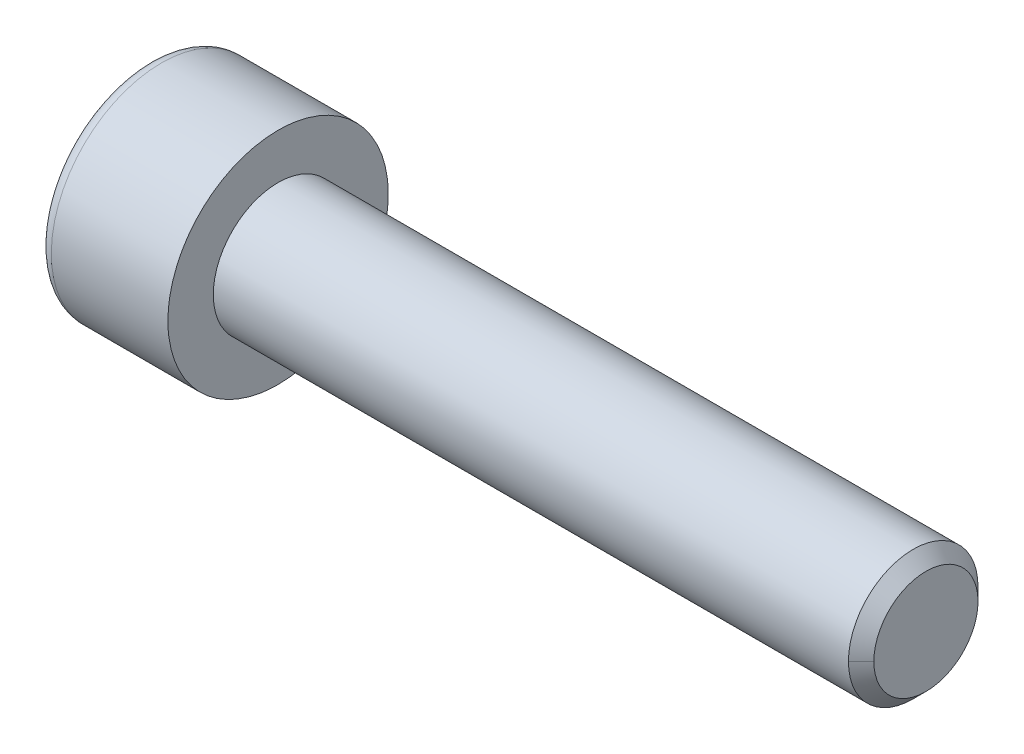
ISO-10303-21;
HEADER;
FILE_DESCRIPTION(('STEP AP214'),'2;1');
FILE_NAME('part.step','',(''),(''),'','','');
FILE_SCHEMA(('AUTOMOTIVE_DESIGN { 1 0 10303 214 1 1 1 1 }'));
ENDSEC;
DATA;
#1=APPLICATION_CONTEXT('core data for automotive mechanical design processes');
#2=APPLICATION_PROTOCOL_DEFINITION('international standard','automotive_design',2000,#1);
#3=PRODUCT_CONTEXT('',#1,'mechanical');
#4=PRODUCT('Part','Part','',(#3));
#5=PRODUCT_RELATED_PRODUCT_CATEGORY('part','',(#4));
#6=PRODUCT_DEFINITION_FORMATION('','',#4);
#7=PRODUCT_DEFINITION_CONTEXT('part definition',#1,'design');
#8=PRODUCT_DEFINITION('design','',#6,#7);
#9=PRODUCT_DEFINITION_SHAPE('','',#8);
#10=(LENGTH_UNIT() NAMED_UNIT(*) SI_UNIT(.MILLI.,.METRE.));
#11=(NAMED_UNIT(*) PLANE_ANGLE_UNIT() SI_UNIT($,.RADIAN.));
#12=(NAMED_UNIT(*) SI_UNIT($,.STERADIAN.) SOLID_ANGLE_UNIT());
#13=UNCERTAINTY_MEASURE_WITH_UNIT(LENGTH_MEASURE(1.E-05),#10,'distance_accuracy_value','');
#14=(GEOMETRIC_REPRESENTATION_CONTEXT(3) GLOBAL_UNCERTAINTY_ASSIGNED_CONTEXT((#13)) GLOBAL_UNIT_ASSIGNED_CONTEXT((#10,
#11,#12)) REPRESENTATION_CONTEXT('',''));
#15=CARTESIAN_POINT('',(0.,0.,0.));
#16=DIRECTION('',(0.,0.,1.));
#17=DIRECTION('',(1.,0.,0.));
#18=AXIS2_PLACEMENT_3D('',#15,#16,#17);
#19=CARTESIAN_POINT('',(25.,-2.03335088,-2.03335088));
#20=DIRECTION('',(1.,0.,0.));
#21=DIRECTION('',(0.,1.,0.));
#22=AXIS2_PLACEMENT_3D('',#19,#20,#21);
#23=PLANE('',#22);
#24=CARTESIAN_POINT('',(25.,0.,0.));
#25=DIRECTION('',(-1.,0.,0.));
#26=DIRECTION('',(0.,0.,1.));
#27=AXIS2_PLACEMENT_3D('',#24,#25,#26);
#28=CIRCLE('',#27,2.00924);
#29=CARTESIAN_POINT('',(25.,-6.86836687895142E-10,-2.00923999999999));
#30=VERTEX_POINT('',#29);
#31=CARTESIAN_POINT('',(25.,-2.40554743613292E-10,2.00923999999999));
#32=VERTEX_POINT('',#31);
#33=EDGE_CURVE('E88',#30,#32,#28,.F.);
#34=ORIENTED_EDGE('',*,*,#33,.T.);
#35=CARTESIAN_POINT('',(25.,0.,0.));
#36=DIRECTION('',(-1.,0.,0.));
#37=DIRECTION('',(0.,0.,1.));
#38=AXIS2_PLACEMENT_3D('',#35,#36,#37);
#39=CIRCLE('',#38,2.00924);
#40=EDGE_CURVE('E21',#32,#30,#39,.F.);
#41=ORIENTED_EDGE('',*,*,#40,.T.);
#42=EDGE_LOOP('',(#34,#41));
#43=FACE_BOUND('',#42,.T.);
#44=ADVANCED_FACE('F17',(#43),#23,.T.);
#45=CARTESIAN_POINT('',(25.,0.,2.00924));
#46=CARTESIAN_POINT('',(24.50924,0.,2.5));
#47=(BOUNDED_CURVE() B_SPLINE_CURVE(1,(#45,#46),.UNSPECIFIED.,.F.,
.F.) B_SPLINE_CURVE_WITH_KNOTS((2,2),(0.,1.00000000000004),
.UNSPECIFIED.) CURVE() GEOMETRIC_REPRESENTATION_ITEM() RATIONAL_B_SPLINE_CURVE((1.,1.)) REPRESENTATION_ITEM(''));
#48=CARTESIAN_POINT('',(1024.50924,0.,0.));
#49=DIRECTION('',(-1.,0.,0.));
#50=AXIS1_PLACEMENT('',#48,#49);
#51=SURFACE_OF_REVOLUTION('',#47,#50);
#52=ORIENTED_EDGE('',*,*,#40,.F.);
#53=DIRECTION('',(-0.707106781186547,-1.26986739101621E-10,0.707106781186548));
#54=VECTOR('',#53,1.);
#55=CARTESIAN_POINT('',(24.75462,-4.04899018551151E-10,2.25462));
#56=LINE('',#55,#54);
#57=CARTESIAN_POINT('',(24.50924,-2.24482960848809E-10,2.50000000000001));
#58=VERTEX_POINT('',#57);
#59=EDGE_CURVE('E91',#32,#58,#56,.T.);
#60=ORIENTED_EDGE('',*,*,#59,.T.);
#61=CARTESIAN_POINT('',(24.50924,0.,0.));
#62=DIRECTION('',(-1.,0.,0.));
#63=DIRECTION('',(0.,0.,1.));
#64=AXIS2_PLACEMENT_3D('',#61,#62,#63);
#65=CIRCLE('',#64,2.5);
#66=CARTESIAN_POINT('',(24.50924,-1.02551714257666E-09,-2.50000000000001));
#67=VERTEX_POINT('',#66);
#68=EDGE_CURVE('E95',#58,#67,#65,.F.);
#69=ORIENTED_EDGE('',*,*,#68,.T.);
#70=DIRECTION('',(0.707106781186547,2.90060050295602E-10,0.707106781186548));
#71=VECTOR('',#70,1.);
#72=CARTESIAN_POINT('',(24.75462,-9.24860583998472E-10,-2.25462));
#73=LINE('',#72,#71);
#74=EDGE_CURVE('E93',#67,#30,#73,.T.);
#75=ORIENTED_EDGE('',*,*,#74,.T.);
#76=EDGE_LOOP('',(#52,#60,#69,#75));
#77=FACE_BOUND('',#76,.T.);
#78=ADVANCED_FACE('F94',(#77),#51,.T.);
#79=CARTESIAN_POINT('',(25.0001414213562,0.,2.00909857864376));
#80=CARTESIAN_POINT('',(25.,0.,2.00924));
#81=CARTESIAN_POINT('',(24.50924,0.,2.5));
#82=(BOUNDED_CURVE() B_SPLINE_CURVE(1,(#79,#80,#81),.UNSPECIFIED.,.F.,
.F.) B_SPLINE_CURVE_WITH_KNOTS((2,1,2),(-0.000288168011927151,4.62494895986565E-11,1.),
.UNSPECIFIED.) CURVE() GEOMETRIC_REPRESENTATION_ITEM() RATIONAL_B_SPLINE_CURVE((1.,1.,1.)) REPRESENTATION_ITEM(''));
#83=CARTESIAN_POINT('',(1024.50924,0.,0.));
#84=DIRECTION('',(-1.,0.,0.));
#85=AXIS1_PLACEMENT('',#83,#84);
#86=SURFACE_OF_REVOLUTION('',#82,#85);
#87=ORIENTED_EDGE('',*,*,#74,.F.);
#88=CARTESIAN_POINT('',(24.50924,0.,0.));
#89=DIRECTION('',(-1.,0.,0.));
#90=DIRECTION('',(0.,0.,1.));
#91=AXIS2_PLACEMENT_3D('',#88,#89,#90);
#92=CIRCLE('',#91,2.5);
#93=EDGE_CURVE('E108',#67,#58,#92,.F.);
#94=ORIENTED_EDGE('',*,*,#93,.T.);
#95=ORIENTED_EDGE('',*,*,#59,.F.);
#96=ORIENTED_EDGE('',*,*,#33,.F.);
#97=EDGE_LOOP('',(#87,#94,#95,#96));
#98=FACE_BOUND('',#97,.T.);
#99=ADVANCED_FACE('F101',(#98),#86,.T.);
#100=CARTESIAN_POINT('',(-1.166666666,0.,0.));
#101=CARTESIAN_POINT('',(-2.508,0.,2.323257483));
#102=(BOUNDED_CURVE() B_SPLINE_CURVE(1,(#100,#101),.UNSPECIFIED.,.F.,
.F.) B_SPLINE_CURVE_WITH_KNOTS((2,2),(0.,1.),
.UNSPECIFIED.) CURVE() GEOMETRIC_REPRESENTATION_ITEM() RATIONAL_B_SPLINE_CURVE((1.,1.)) REPRESENTATION_ITEM(''));
#103=CARTESIAN_POINT('',(997.492,0.,0.));
#104=DIRECTION('',(-1.,0.,0.));
#105=AXIS1_PLACEMENT('',#103,#104);
#106=SURFACE_OF_REVOLUTION('',#102,#105);
#107=CARTESIAN_POINT('',(-1.166666666,0.,0.));
#108=VERTEX_POINT('',#107);
#109=VERTEX_LOOP('',#108);
#110=FACE_BOUND('',#109,.T.);
#111=CARTESIAN_POINT('',(-2.49999999994076,-2.,-1.15470053775231));
#112=CARTESIAN_POINT('',(-2.48567655165512,-2.,-1.10507931773432));
#113=CARTESIAN_POINT('',(-2.47198871078964,-2.,-1.05526823641219));
#114=CARTESIAN_POINT('',(-2.44604690640692,-2.,-0.955218692575869));
#115=CARTESIAN_POINT('',(-2.43379447460794,-2.,-0.904979833791241));
#116=CARTESIAN_POINT('',(-2.41091380130688,-2.,-0.804117092943882));
#117=CARTESIAN_POINT('',(-2.40028604275163,-2.,-0.753493101073635));
#118=CARTESIAN_POINT('',(-2.37601016772818,-2.,-0.626639542162072));
#119=CARTESIAN_POINT('',(-2.36348630626666,-2.,-0.550189309523977));
#120=CARTESIAN_POINT('',(-2.34306885503139,-2.,-0.396671574205417));
#121=CARTESIAN_POINT('',(-2.33517516655927,-2.,-0.319604084718113));
#122=CARTESIAN_POINT('',(-2.32268432555711,-2.,-0.139619688842338));
#123=CARTESIAN_POINT('',(-2.32003239400898,-2.,-0.0365584864338747));
#124=CARTESIAN_POINT('',(-2.32397535370215,-2.,0.169407104774963));
#125=CARTESIAN_POINT('',(-2.33057305877728,-2.,0.272311436318865));
#126=CARTESIAN_POINT('',(-2.35234479113069,-2.,0.477116467372633));
#127=CARTESIAN_POINT('',(-2.36751355138492,-2.,0.579017744182629));
#128=CARTESIAN_POINT('',(-2.40514304704038,-2.,0.781457900875611));
#129=CARTESIAN_POINT('',(-2.42760505461591,-2.,0.881996539881626));
#130=CARTESIAN_POINT('',(-2.46035679018023,-2.,1.01073167838896));
#131=CARTESIAN_POINT('',(-2.46797293838578,-2.,1.03963527257175));
#132=CARTESIAN_POINT('',(-2.48365524704736,-2.,1.09727927796046));
#133=CARTESIAN_POINT('',(-2.49172080087081,-2.,1.12601985408537));
#134=CARTESIAN_POINT('',(-2.49999999998173,-2.,1.15470053789423));
#135=B_SPLINE_CURVE_WITH_KNOTS('',3,(#111,#112,#113,#114,#115,#116,#117,#118,#119,#120,#121,
#122,#123,#124,#125,#126,#127,#128,#129,#130,#131,#132,#133,#134),.UNSPECIFIED.,.F.,.F.,(4,2,2,
2,2,2,2,2,2,2,2,4),(0.,0.154946742163082,0.310057349590026,0.465213975574503,0.697487987448034,
0.929757047907446,1.23861321261436,1.54756335490868,1.85632384950566,2.16513823071313,
2.25480717406297,2.34435787914655),.UNSPECIFIED.);
#136=CARTESIAN_POINT('',(-2.4999999998186,-1.99999999993079,-1.15470053803996));
#137=VERTEX_POINT('',#136);
#138=CARTESIAN_POINT('',(-2.49999999995344,-1.99999999986934,1.15470053802255));
#139=VERTEX_POINT('',#138);
#140=EDGE_CURVE('E400',#137,#139,#135,.T.);
#141=ORIENTED_EDGE('',*,*,#140,.T.);
#142=CARTESIAN_POINT('',(-2.49999999992515,-1.99999999973868,1.15470053815087));
#143=CARTESIAN_POINT('',(-2.48567655163891,-1.95702676264271,1.17951114816952));
#144=CARTESIAN_POINT('',(-2.47198871077284,-1.91388910083416,1.20441668884029));
#145=CARTESIAN_POINT('',(-2.44604690638884,-1.82724365424769,1.25444146077793));
#146=CARTESIAN_POINT('',(-2.43379447458918,-1.78373552628951,1.27956089018003));
#147=CARTESIAN_POINT('',(-2.4109138012866,-1.6963858304333,1.32999226062335));
#148=CARTESIAN_POINT('',(-2.40028604273051,-1.65254416743919,1.35530425656833));
#149=CARTESIAN_POINT('',(-2.37601016770505,-1.54268576287784,1.41873103604867));
#150=CARTESIAN_POINT('',(-2.36348630624236,-1.47647791929806,1.45695615238246));
#151=CARTESIAN_POINT('',(-2.3430688550045,-1.34352766060085,1.5337150200714));
#152=CARTESIAN_POINT('',(-2.33517516653094,-1.27678525690902,1.57224876482995));
#153=CARTESIAN_POINT('',(-2.32268432552556,-1.1209141978217,1.66224096280127));
#154=CARTESIAN_POINT('',(-2.32003239397535,-1.03166057840722,1.71377156402406));
#155=CARTESIAN_POINT('',(-2.32397535366393,-0.853289144146355,1.81675435966568));
#156=CARTESIAN_POINT('',(-2.33057305873656,-0.764171378885523,1.86820652545626));
#157=CARTESIAN_POINT('',(-2.35234479108477,-0.586805019200706,1.97060904102052));
#158=CARTESIAN_POINT('',(-2.36751355133635,-0.498555924820148,2.02155967944427));
#159=CARTESIAN_POINT('',(-2.40514304698655,-0.32323760640756,2.12277975782806));
#160=CARTESIAN_POINT('',(-2.4276050545595,-0.236168590981107,2.17304907734962));
#161=CARTESIAN_POINT('',(-2.46035679014959,-0.124680690593866,2.23741664668419));
#162=CARTESIAN_POINT('',(-2.46797293838541,-0.0996494436766156,2.25186844383778));
#163=CARTESIAN_POINT('',(-2.48365524711095,-0.0497282704466456,2.28069044665586));
#164=CARTESIAN_POINT('',(-2.4917208009681,-0.024838201309885,2.29506073477984));
#165=CARTESIAN_POINT('',(-2.50000000011427,-4.40704641312993E-10,2.30940107674556));
#166=B_SPLINE_CURVE_WITH_KNOTS('',3,(#142,#143,#144,#145,#146,#147,#148,#149,#150,#151,#152,
#153,#154,#155,#156,#157,#158,#159,#160,#161,#162,#163,#164,#165),.UNSPECIFIED.,.F.,.F.,(4,2,2,
2,2,2,2,2,2,2,2,4),(0.,0.154946742161569,0.310057349586999,0.465213975569957,0.697487987440142,
0.929757047896212,1.23861321259006,1.54756335487124,1.85632384945638,2.16513823065216,
2.25480717435215,2.34435787978498),.UNSPECIFIED.);
#167=CARTESIAN_POINT('',(-2.50000000028077,-5.87977686074181E-11,2.30940107703395));
#168=VERTEX_POINT('',#167);
#169=EDGE_CURVE('E409',#139,#168,#166,.T.);
#170=ORIENTED_EDGE('',*,*,#169,.T.);
#171=CARTESIAN_POINT('',(-2.50000000016212,2.97141322209485E-10,2.30940107682845));
#172=CARTESIAN_POINT('',(-2.48567655186644,0.0429732373984809,2.2845904668067));
#173=CARTESIAN_POINT('',(-2.4719887109907,0.0861108992124214,2.25968492613282));
#174=CARTESIAN_POINT('',(-2.44604690658692,0.172756345809803,2.20966015418887));
#175=CARTESIAN_POINT('',(-2.43379447477714,0.216264473773518,2.18454072478358));
#176=CARTESIAN_POINT('',(-2.4109138014539,0.303614169640957,2.13410935433377));
#177=CARTESIAN_POINT('',(-2.40028604288728,0.347455832640779,2.1087973583855));
#178=CARTESIAN_POINT('',(-2.37601016783492,0.457314237217623,2.04537057889622));
#179=CARTESIAN_POINT('',(-2.36348630635573,0.523522080807346,2.00714546255668));
#180=CARTESIAN_POINT('',(-2.34306885508494,0.656472339525236,1.93038659485581));
#181=CARTESIAN_POINT('',(-2.33517516659494,0.723214743227788,1.89185285009106));
#182=CARTESIAN_POINT('',(-2.32268432555431,0.879085802316307,1.80186065211906));
#183=CARTESIAN_POINT('',(-2.32003239398313,0.968339421721444,1.75033005090165));
#184=CARTESIAN_POINT('',(-2.32397535362841,1.14671085596532,1.64734725526985));
#185=CARTESIAN_POINT('',(-2.3305730586787,1.2358286212185,1.59589508948368));
#186=CARTESIAN_POINT('',(-2.35234479098305,1.41319498088894,1.49349257392772));
#187=CARTESIAN_POINT('',(-2.36751355121305,1.50144407526278,1.44254193550786));
#188=CARTESIAN_POINT('',(-2.40514304682218,1.67676239366279,1.34132185713132));
#189=CARTESIAN_POINT('',(-2.42760505437561,1.76383140908338,1.29105253761314));
#190=CARTESIAN_POINT('',(-2.46035678994391,1.87531930946905,1.22668496827949));
#191=CARTESIAN_POINT('',(-2.46797293817638,1.90035055639045,1.2122331711235));
#192=CARTESIAN_POINT('',(-2.48365524689563,1.95027172962873,1.18341116830062));
#193=CARTESIAN_POINT('',(-2.49172080074984,1.97516179876965,1.16904088017424));
#194=CARTESIAN_POINT('',(-2.49999999989325,1.99999999964298,1.15470053820613));
#195=B_SPLINE_CURVE_WITH_KNOTS('',3,(#171,#172,#173,#174,#175,#176,#177,#178,#179,#180,#181,
#182,#183,#184,#185,#186,#187,#188,#189,#190,#191,#192,#193,#194),.UNSPECIFIED.,.F.,.F.,(4,2,2,
2,2,2,2,2,2,2,2,4),(0.,0.154946742187278,0.310057349638523,0.465213975647335,0.69748798755956,
0.92975704805761,1.23861321272094,1.54756335497137,1.85632384952381,2.16513823068683,
2.25480717439816,2.34435787984248),.UNSPECIFIED.);
#196=CARTESIAN_POINT('',(-2.49999999995344,1.99999999982149,1.15470053810544));
#197=VERTEX_POINT('',#196);
#198=EDGE_CURVE('E418',#168,#197,#195,.T.);
#199=ORIENTED_EDGE('',*,*,#198,.T.);
#200=CARTESIAN_POINT('',(-2.50000000001363,2.,1.15470053800475));
#201=CARTESIAN_POINT('',(-2.48567655172505,2.,1.10507931798486));
#202=CARTESIAN_POINT('',(-2.47198871085661,2.,1.05526823666081));
#203=CARTESIAN_POINT('',(-2.44604690646785,2.,0.955218692820608));
#204=CARTESIAN_POINT('',(-2.43379447466577,2.,0.904979834034012));
#205=CARTESIAN_POINT('',(-2.41091380135833,2.,0.804117093182673));
#206=CARTESIAN_POINT('',(-2.40028604279979,2.,0.753493101310414));
#207=CARTESIAN_POINT('',(-2.37601016776802,2.,0.626639542393354));
#208=CARTESIAN_POINT('',(-2.36348630630148,2.,0.550189309751709));
#209=CARTESIAN_POINT('',(-2.34306885505614,2.,0.396671574425779));
#210=CARTESIAN_POINT('',(-2.33517516657896,2.,0.319604084934656));
#211=CARTESIAN_POINT('',(-2.32268432556593,2.,0.139619689058439));
#212=CARTESIAN_POINT('',(-2.32003239401132,2.,0.0365584866532823));
#213=CARTESIAN_POINT('',(-2.32397535369116,2.,-0.169407104549539));
#214=CARTESIAN_POINT('',(-2.33057305875947,2.,-0.272311436090732));
#215=CARTESIAN_POINT('',(-2.3523447910994,2.,-0.477116467139405));
#216=CARTESIAN_POINT('',(-2.36751355134697,2.,-0.579017743947016));
#217=CARTESIAN_POINT('',(-2.40514304698976,2.,-0.781457900635529));
#218=CARTESIAN_POINT('',(-2.42760505455929,2.,-0.881996539639461));
#219=CARTESIAN_POINT('',(-2.46035679011629,2.,-1.01073167814332));
#220=CARTESIAN_POINT('',(-2.46797293832006,2.,-1.03963527232473));
#221=CARTESIAN_POINT('',(-2.48365524697808,2.,-1.0972792777107));
#222=CARTESIAN_POINT('',(-2.49172080079975,2.,-1.12601985383426));
#223=CARTESIAN_POINT('',(-2.49999999990886,2.,-1.1547005376418));
#224=B_SPLINE_CURVE_WITH_KNOTS('',3,(#200,#201,#202,#203,#204,#205,#206,#207,#208,#209,#210,
#211,#212,#213,#214,#215,#216,#217,#218,#219,#220,#221,#222,#223),.UNSPECIFIED.,.F.,.F.,(4,2,2,
2,2,2,2,2,2,2,2,4),(0.,0.154946742170985,0.310057349605864,0.465213975598284,0.697487987484767,
0.929757047957124,1.23861321265468,1.54756335493957,1.85632384952649,2.16513823072387,
2.2548071740683,2.34435787914655),.UNSPECIFIED.);
#225=CARTESIAN_POINT('',(-2.49999999995344,1.99999999997865,-1.15470053783323));
#226=VERTEX_POINT('',#225);
#227=EDGE_CURVE('E427',#197,#226,#224,.T.);
#228=ORIENTED_EDGE('',*,*,#227,.T.);
#229=CARTESIAN_POINT('',(-2.49999999999803,1.9999999999573,-1.15470053802466));
#230=CARTESIAN_POINT('',(-2.48567655170877,1.95702676285955,-1.17951114804433));
#231=CARTESIAN_POINT('',(-2.4719887108397,1.9138891010492,-1.20441668871613));
#232=CARTESIAN_POINT('',(-2.44604690644962,1.8272436544591,-1.25444146065587));
#233=CARTESIAN_POINT('',(-2.43379447464687,1.78373552649906,-1.27956089005904));
#234=CARTESIAN_POINT('',(-2.41091380133792,1.69638583063912,-1.32999226050452));
#235=CARTESIAN_POINT('',(-2.40028604277855,1.65254416764312,-1.35530425645059));
#236=CARTESIAN_POINT('',(-2.37601016774484,1.54268576307708,-1.41873103593363));
#237=CARTESIAN_POINT('',(-2.36348630627713,1.47647791949446,-1.45695615226908));
#238=CARTESIAN_POINT('',(-2.34306885502922,1.34352766079131,-1.53371501996143));
#239=CARTESIAN_POINT('',(-2.33517516655063,1.2767852570964,-1.57224876472177));
#240=CARTESIAN_POINT('',(-2.32268432553439,1.12091419800915,-1.66224096269304));
#241=CARTESIAN_POINT('',(-2.32003239397769,1.03166057859777,-1.71377156391405));
#242=CARTESIAN_POINT('',(-2.32397535365287,0.853289144342585,-1.81675435955238));
#243=CARTESIAN_POINT('',(-2.33057305871859,0.76417137908434,-1.86820652534147));
#244=CARTESIAN_POINT('',(-2.35234479105324,0.586805019403965,-1.97060904090317));
#245=CARTESIAN_POINT('',(-2.3675135512982,0.498555925025262,-2.02155967932584));
#246=CARTESIAN_POINT('',(-2.40514304693586,0.323237606616101,-2.12277975770766));
#247=CARTESIAN_POINT('',(-2.42760505450289,0.236168591191219,-2.17304907722831));
#248=CARTESIAN_POINT('',(-2.46035679011618,0.124680690702564,-2.23741664662143));
#249=CARTESIAN_POINT('',(-2.4679729383828,0.0996494436828631,-2.25186844383417));
#250=CARTESIAN_POINT('',(-2.48365524717361,0.0497282702491337,-2.28069044676989));
#251=CARTESIAN_POINT('',(-2.49172080106521,0.0248382010110627,-2.29506073495237));
#252=CARTESIAN_POINT('',(-2.5000000002475,4.09998984578272E-11,-2.30940107697633));
#253=B_SPLINE_CURVE_WITH_KNOTS('',3,(#229,#230,#231,#232,#233,#234,#235,#236,#237,#238,#239,
#240,#241,#242,#243,#244,#245,#246,#247,#248,#249,#250,#251,#252),.UNSPECIFIED.,.F.,.F.,(4,2,2,
2,2,2,2,2,2,2,2,4),(0.,0.154946742169962,0.310057349603811,0.465213975595197,0.697487987477565,
0.929757047945802,1.23861321262949,1.5475633549004,1.8563238494762,2.16513823066278,
2.25480717472947,2.34435788052809),.UNSPECIFIED.);
#254=CARTESIAN_POINT('',(-2.50000000026117,-9.47332157419396E-10,-2.309401077));
#255=VERTEX_POINT('',#254);
#256=EDGE_CURVE('E436',#226,#255,#253,.T.);
#257=ORIENTED_EDGE('',*,*,#256,.T.);
#258=CARTESIAN_POINT('',(-2.50000000002889,-6.96845553583441E-10,-2.30940107659768));
#259=CARTESIAN_POINT('',(-2.48567655173841,-0.0429732377951086,-2.28459046657771));
#260=CARTESIAN_POINT('',(-2.47198871086813,-0.0861108996059853,-2.2596849259056));
#261=CARTESIAN_POINT('',(-2.4460469064756,-0.172756346197175,-2.20966015396523));
#262=CARTESIAN_POINT('',(-2.4337944746716,-0.216264474157762,-2.18454072456174));
#263=CARTESIAN_POINT('',(-2.41091380136002,-0.303614170018815,-2.13410935411562));
#264=CARTESIAN_POINT('',(-2.40028604279926,-0.347455833015379,-2.10879735816922));
#265=CARTESIAN_POINT('',(-2.37601016776189,-0.457314237583502,-2.04537057868498));
#266=CARTESIAN_POINT('',(-2.36348630629192,-0.523522081167679,-2.00714546234864));
#267=CARTESIAN_POINT('',(-2.34306885503964,-0.65647233987405,-1.93038659465442));
#268=CARTESIAN_POINT('',(-2.33517516655893,-0.72321474357063,-1.89185284989312));
#269=CARTESIAN_POINT('',(-2.32268432553819,-0.879085802658592,-1.80186065192144));
#270=CARTESIAN_POINT('',(-2.3200323939788,-0.968339422069034,-1.75033005070097));
#271=CARTESIAN_POINT('',(-2.32397535364841,-1.14671085632258,-1.64734725506358));
#272=CARTESIAN_POINT('',(-2.33057305871125,-1.23582862158012,-1.5958950892749));
#273=CARTESIAN_POINT('',(-2.35234479104024,-1.41319498125865,-1.49349257371427));
#274=CARTESIAN_POINT('',(-2.36751355128237,-1.50144407563621,-1.44254193529225));
#275=CARTESIAN_POINT('',(-2.4051430469146,-1.67676239404317,-1.34132185691171));
#276=CARTESIAN_POINT('',(-2.42760505447902,-1.763831409467,-1.29105253739166));
#277=CARTESIAN_POINT('',(-2.46035679005192,-1.87531930982753,-1.22668496807252));
#278=CARTESIAN_POINT('',(-2.46797293827813,-1.90035055672077,-1.21223317093279));
#279=CARTESIAN_POINT('',(-2.48365524698376,-1.950271729903,-1.18341116814227));
#280=CARTESIAN_POINT('',(-2.49172080083059,-1.97516179901603,-1.16904088003199));
#281=CARTESIAN_POINT('',(-2.49999999996612,-1.99999999986159,-1.15470053807991));
#282=B_SPLINE_CURVE_WITH_KNOTS('',3,(#258,#259,#260,#261,#262,#263,#264,#265,#266,#267,#268,
#269,#270,#271,#272,#273,#274,#275,#276,#277,#278,#279,#280,#281),.UNSPECIFIED.,.F.,.F.,(4,2,2,
2,2,2,2,2,2,2,2,4),(0.,0.154946742172695,0.310057349609295,0.465213975603437,0.697487987492204,
0.929757047966837,1.23861321264752,1.54756335491544,1.85632384948608,2.1651382306673,
2.2548071742795,2.34435787962486),.UNSPECIFIED.);
#283=EDGE_CURVE('E439',#255,#137,#282,.T.);
#284=ORIENTED_EDGE('',*,*,#283,.T.);
#285=EDGE_LOOP('',(#141,#170,#199,#228,#257,#284));
#286=FACE_BOUND('',#285,.T.);
#287=ADVANCED_FACE('F180',(#110,#286),#106,.F.);
#288=CARTESIAN_POINT('',(0.,2.5,0.));
#289=CARTESIAN_POINT('',(24.50924,2.5,0.));
#290=(BOUNDED_CURVE() B_SPLINE_CURVE(1,(#288,#289),.UNSPECIFIED.,.F.,
.F.) B_SPLINE_CURVE_WITH_KNOTS((2,2),(0.,1.),
.UNSPECIFIED.) CURVE() GEOMETRIC_REPRESENTATION_ITEM() RATIONAL_B_SPLINE_CURVE((1.,1.)) REPRESENTATION_ITEM(''));
#291=CARTESIAN_POINT('',(14.,0.,0.));
#292=DIRECTION('',(1.,0.,0.));
#293=AXIS1_PLACEMENT('',#291,#292);
#294=SURFACE_OF_REVOLUTION('',#290,#293);
#295=CARTESIAN_POINT('',(0.,2.5,-1.49654235150772E-10));
#296=CARTESIAN_POINT('',(0.,2.49999957935712,-0.0701921601458649));
#297=CARTESIAN_POINT('',(0.,2.49704119341874,-0.140397219847306));
#298=CARTESIAN_POINT('',(0.,2.48522688335223,-0.280322179338116));
#299=CARTESIAN_POINT('',(0.,2.47636921808606,-0.350041929750868));
#300=CARTESIAN_POINT('',(0.,2.45279620031375,-0.488604766662132));
#301=CARTESIAN_POINT('',(0.,2.43807154939718,-0.557446281672286));
#302=CARTESIAN_POINT('',(0.,2.40286605984876,-0.693682439725407));
#303=CARTESIAN_POINT('',(0.,2.3823805500333,-0.761075860650563));
#304=CARTESIAN_POINT('',(0.,2.3125659555721,-0.960073508686272));
#305=CARTESIAN_POINT('',(0.,2.25482146131052,-1.0888300172892));
#306=CARTESIAN_POINT('',(0.,2.11850508049911,-1.33480670440696));
#307=CARTESIAN_POINT('',(0.,2.03993240221167,-1.45202644414458));
#308=CARTESIAN_POINT('',(0.,1.90824104287933,-1.61665670252642));
#309=CARTESIAN_POINT('',(0.,1.86200376385574,-1.66969790920959));
#310=CARTESIAN_POINT('',(0.,1.76526174320805,-1.77166010130448));
#311=CARTESIAN_POINT('',(0.,1.71476115904218,-1.82058500992368));
#312=CARTESIAN_POINT('',(0.,1.60979378908777,-1.91402800851678));
#313=CARTESIAN_POINT('',(0.,1.55532521700593,-1.95854409219933));
#314=CARTESIAN_POINT('',(0.,1.44283652725317,-2.04283394027423));
#315=CARTESIAN_POINT('',(0.,1.384815589926,-2.08260660390377));
#316=CARTESIAN_POINT('',(0.,1.20605688640292,-2.19433902063112));
#317=CARTESIAN_POINT('',(0.,1.08051229837999,-2.25881176841051));
#318=CARTESIAN_POINT('',(0.,0.820448664808011,-2.36572576693554));
#319=CARTESIAN_POINT('',(0.,0.68592971512666,-2.40816725298534));
#320=CARTESIAN_POINT('',(0.,0.411658452676093,-2.46987540916738));
#321=CARTESIAN_POINT('',(0.,0.271906111962458,-2.48914195553559));
#322=CARTESIAN_POINT('',(0.,-0.00884938366135953,-2.50393336511555));
#323=CARTESIAN_POINT('',(0.,-0.149852538571541,-2.4994582283273));
#324=CARTESIAN_POINT('',(0.,-0.429089566460181,-2.46691127452929));
#325=CARTESIAN_POINT('',(0.,-0.567323454223614,-2.43883958353471));
#326=CARTESIAN_POINT('',(0.,-0.837181598048732,-2.35984414823284));
#327=CARTESIAN_POINT('',(0.,-0.968805783498485,-2.30892015985052));
#328=CARTESIAN_POINT('',(0.,-1.15831539859643,-2.21658970540334));
#329=CARTESIAN_POINT('',(0.,-1.22019432815808,-2.18313388353604));
#330=CARTESIAN_POINT('',(0.,-1.34091721232836,-2.11113062632916));
#331=CARTESIAN_POINT('',(0.,-1.39976186639087,-2.07258437178567));
#332=CARTESIAN_POINT('',(0.,-1.51396685336594,-1.99068831759965));
#333=CARTESIAN_POINT('',(0.,-1.56932875186804,-1.9473407008401));
#334=CARTESIAN_POINT('',(0.,-1.6762490953027,-1.85610831988026));
#335=CARTESIAN_POINT('',(0.,-1.72780381803106,-1.8082192173379));
#336=CARTESIAN_POINT('',(0.,-1.87606499403363,-1.65833806512721));
#337=CARTESIAN_POINT('',(0.,-1.96651979569876,-1.55002342155054));
#338=CARTESIAN_POINT('',(0.,-2.12792802530579,-1.31973215011787));
#339=CARTESIAN_POINT('',(0.,-2.19888219449693,-1.19775604180344));
#340=CARTESIAN_POINT('',(0.,-2.28922037065546,-1.00719593199043));
#341=CARTESIAN_POINT('',(0.,-2.31667397069351,-0.94232814999219));
#342=CARTESIAN_POINT('',(0.,-2.36599984787504,-0.810545468672519));
#343=CARTESIAN_POINT('',(0.,-2.38787664192646,-0.743632275537157));
#344=CARTESIAN_POINT('',(0.,-2.42587892397024,-0.608313490812811));
#345=CARTESIAN_POINT('',(0.,-2.44201349377068,-0.53991043906132));
#346=CARTESIAN_POINT('',(0.,-2.46846529093155,-0.402001503028459));
#347=CARTESIAN_POINT('',(0.,-2.47878423409518,-0.332495950250272));
#348=CARTESIAN_POINT('',(0.,-2.49076983986528,-0.219068891475801));
#349=CARTESIAN_POINT('',(0.,-2.49423005455374,-0.175328990224659));
#350=CARTESIAN_POINT('',(0.,-2.49884526605357,-0.0877277389086183));
#351=CARTESIAN_POINT('',(0.,-2.50000026286494,-0.0438663888437195));
#352=CARTESIAN_POINT('',(0.,-2.49999957938051,0.0701921593121999));
#353=CARTESIAN_POINT('',(0.,-2.49704119346556,0.140397219014432));
#354=CARTESIAN_POINT('',(0.,-2.48522688344576,0.280322178508838));
#355=CARTESIAN_POINT('',(0.,-2.47636921820289,0.350041928924395));
#356=CARTESIAN_POINT('',(0.,-2.45279620047681,0.488604765843589));
#357=CARTESIAN_POINT('',(0.,-2.43807154958317,0.557446280858868));
#358=CARTESIAN_POINT('',(0.,-2.40286606008009,0.693682438924112));
#359=CARTESIAN_POINT('',(0.,-2.38238055028705,0.761075859856269));
#360=CARTESIAN_POINT('',(0.,-2.31256595589212,0.960073507915408));
#361=CARTESIAN_POINT('',(0.,-2.25482146167347,1.08883001653758));
#362=CARTESIAN_POINT('',(0.,-2.11850508094405,1.33480670370078));
#363=CARTESIAN_POINT('',(0.,-2.03993240269569,1.4520264434646));
#364=CARTESIAN_POINT('',(0.,-1.90824104341822,1.61665670189033));
#365=CARTESIAN_POINT('',(0.,-1.86200376441232,1.66969790858891));
#366=CARTESIAN_POINT('',(0.,-1.76526174379863,1.77166010071603));
#367=CARTESIAN_POINT('',(0.,-1.71476115964908,1.82058500935205));
#368=CARTESIAN_POINT('',(0.,-1.60979378972582,1.91402800798015));
#369=CARTESIAN_POINT('',(0.,-1.55532521765881,1.95854409168086));
#370=CARTESIAN_POINT('',(0.,-1.44283652793413,2.04283393979327));
#371=CARTESIAN_POINT('',(0.,-1.38481559062021,2.08260660344216));
#372=CARTESIAN_POINT('',(0.,-1.20605688713436,2.1943390202291));
#373=CARTESIAN_POINT('',(0.,-1.08051229913292,2.25881176805034));
#374=CARTESIAN_POINT('',(0.,-0.820448665596576,2.36572576666206));
#375=CARTESIAN_POINT('',(0.,-0.685929715929377,2.4081672527567));
#376=CARTESIAN_POINT('',(0.,-0.411658453499385,2.46987540903016));
#377=CARTESIAN_POINT('',(0.,-0.271906112792172,2.48914195544496));
#378=CARTESIAN_POINT('',(0.,0.00884938282671492,2.5039333651185));
#379=CARTESIAN_POINT('',(0.,0.14985253773839,2.49945822837725));
#380=CARTESIAN_POINT('',(0.,0.429089565637884,2.46691127467232));
#381=CARTESIAN_POINT('',(0.,0.567323453410679,2.43883958372382));
#382=CARTESIAN_POINT('',(0.,0.837181597262128,2.3598441485119));
#383=CARTESIAN_POINT('',(0.,0.968805782728851,2.30892016017345));
#384=CARTESIAN_POINT('',(0.,1.15831539785756,2.21658970578945));
#385=CARTESIAN_POINT('',(0.,1.22019432743036,2.18313388394278));
#386=CARTESIAN_POINT('',(0.,1.34091721162461,2.11113062677616));
#387=CARTESIAN_POINT('',(0.,1.39976186569996,2.07258437225229));
#388=CARTESIAN_POINT('',(0.,1.51396685270234,1.99068831810434));
#389=CARTESIAN_POINT('',(0.,1.56932875121889,1.94734070136324));
#390=CARTESIAN_POINT('',(0.,1.67624909468398,1.85610832043902));
#391=CARTESIAN_POINT('',(0.,1.72780381742831,1.80821921791384));
#392=CARTESIAN_POINT('',(0.,1.87606499348084,1.65833806575257));
#393=CARTESIAN_POINT('',(0.,1.96651979518207,1.55002342220605));
#394=CARTESIAN_POINT('',(0.,2.12792802486587,1.31973215082719));
#395=CARTESIAN_POINT('',(0.,2.19888219409767,1.1977560425364));
#396=CARTESIAN_POINT('',(0.,2.28922037031965,1.00719593275366));
#397=CARTESIAN_POINT('',(0.,2.31667397037926,0.94232815076474));
#398=CARTESIAN_POINT('',(0.,2.36599984760461,0.81054546946189));
#399=CARTESIAN_POINT('',(0.,2.38787664167829,0.743632276334034));
#400=CARTESIAN_POINT('',(0.,2.42587892376722,0.608313491622434));
#401=CARTESIAN_POINT('',(0.,2.44201349359052,0.539910439876178));
#402=CARTESIAN_POINT('',(0.,2.46846529079747,0.402001503851803));
#403=CARTESIAN_POINT('',(0.,2.47878423398432,0.332495951076863));
#404=CARTESIAN_POINT('',(0.,2.49076983982144,0.219068892029811));
#405=CARTESIAN_POINT('',(0.,2.49423005453912,0.175328990502049));
#406=CARTESIAN_POINT('',(0.,2.49884526606818,0.0877277386312289));
#407=CARTESIAN_POINT('',(0.,2.50000026287956,0.043866388288171));
#408=CARTESIAN_POINT('',(0.,2.5,-1.49654235150772E-10));
#409=B_SPLINE_CURVE_WITH_KNOTS('',3,(#295,#296,#297,#298,#299,#300,#301,#302,#303,#304,#305,
#306,#307,#308,#309,#310,#311,#312,#313,#314,#315,#316,#317,#318,#319,#320,#321,#322,#323,#324,
#325,#326,#327,#328,#329,#330,#331,#332,#333,#334,#335,#336,#337,#338,#339,#340,#341,#342,#343,
#344,#345,#346,#347,#348,#349,#350,#351,#352,#353,#354,#355,#356,#357,#358,#359,#360,#361,#362,
#363,#364,#365,#366,#367,#368,#369,#370,#371,#372,#373,#374,#375,#376,#377,#378,#379,#380,#381,
#382,#383,#384,#385,#386,#387,#388,#389,#390,#391,#392,#393,#394,#395,#396,#397,#398,#399,#400,
#401,#402,#403,#404,#405,#406,#407,#408),.UNSPECIFIED.,.T.,.F.,(4,2,2,2,2,2,2,2,2,2,2,2,2,2,2,2,
2,2,2,2,2,2,2,2,2,2,2,2,2,2,2,2,2,2,2,2,2,2,2,2,2,2,2,2,2,2,2,2,2,2,2,2,2,2,2,2,4),(0.,
0.210536096820452,0.421134359699887,0.632067729618859,0.843172630152281,1.26437611909931,
1.6855956214669,1.89648135010458,2.1071637531372,2.31794159353163,2.52876825245848,
2.94998199754241,3.3711912437741,3.79240273943195,4.2136142350898,4.63482348132148,
5.05603722640542,5.26686388533231,5.47764172572677,5.68832412875935,5.89920985739701,
6.32042935976462,6.74163284871162,6.95273774924558,7.16367111916518,7.37426938204421,
7.5848054788639,7.71637940599957,7.84795333313523,8.05848942995493,8.26908769283395,
8.48002106275356,8.69112596328752,9.11232945223452,9.53354895460213,9.74443468323978,
9.95511708627237,10.1658949266668,10.3767215855937,10.7979353306777,11.2191445769093,
11.6403560725672,12.061567568225,12.4827768144567,12.9039905595407,13.1148172184675,
13.3255950588619,13.5362774618946,13.7471631905322,14.1683826928998,14.5895861818469,
14.8006910823803,15.0116244522993,15.2222227151787,15.4327588119991,15.5643327399678,
15.6959066679366),.UNSPECIFIED.);
#410=CARTESIAN_POINT('',(0.,2.5,-1.49654235150772E-10));
#411=VERTEX_POINT('',#410);
#412=EDGE_CURVE('E384',#411,#411,#409,.T.);
#413=ORIENTED_EDGE('',*,*,#412,.F.);
#414=EDGE_LOOP('',(#413));
#415=FACE_BOUND('',#414,.T.);
#416=ORIENTED_EDGE('',*,*,#68,.F.);
#417=ORIENTED_EDGE('',*,*,#93,.F.);
#418=EDGE_LOOP('',(#416,#417));
#419=FACE_BOUND('',#418,.T.);
#420=ADVANCED_FACE('F173',(#415,#419),#294,.T.);
#421=CARTESIAN_POINT('',(-5.,-2.,-1.154700538));
#422=DIRECTION('',(0.,-0.500000000201594,-0.866025403668048));
#423=DIRECTION('',(0.,0.866025403668048,-0.500000000201594));
#424=AXIS2_PLACEMENT_3D('',#421,#422,#423);
#425=PLANE('',#424);
#426=DIRECTION('',(0.,0.866025403668048,-0.500000000201594));
#427=VECTOR('',#426,1.);
#428=CARTESIAN_POINT('',(-5.,-2.00000000003796,-1.15470053797809));
#429=LINE('',#428,#427);
#430=CARTESIAN_POINT('',(-5.,-2.,-1.154700538));
#431=VERTEX_POINT('',#430);
#432=CARTESIAN_POINT('',(-5.,0.,-2.309401077));
#433=VERTEX_POINT('',#432);
#434=EDGE_CURVE('E380',#431,#433,#429,.T.);
#435=ORIENTED_EDGE('',*,*,#434,.F.);
#436=DIRECTION('',(1.,0.,0.));
#437=VECTOR('',#436,1.);
#438=CARTESIAN_POINT('',(-5.,-2.,-1.154700538));
#439=LINE('',#438,#437);
#440=EDGE_CURVE('E390',#431,#137,#439,.T.);
#441=ORIENTED_EDGE('',*,*,#440,.T.);
#442=ORIENTED_EDGE('',*,*,#283,.F.);
#443=DIRECTION('',(1.,0.,0.));
#444=VECTOR('',#443,1.);
#445=CARTESIAN_POINT('',(-5.,0.,-2.309401077));
#446=LINE('',#445,#444);
#447=EDGE_CURVE('E430',#255,#433,#446,.F.);
#448=ORIENTED_EDGE('',*,*,#447,.T.);
#449=EDGE_LOOP('',(#435,#441,#442,#448));
#450=FACE_BOUND('',#449,.T.);
#451=ADVANCED_FACE('F179',(#450),#425,.F.);
#452=CARTESIAN_POINT('',(-5.,0.,-2.309401077));
#453=DIRECTION('',(0.,0.500000000201594,-0.866025403668048));
#454=DIRECTION('',(0.,0.866025403668048,0.500000000201594));
#455=AXIS2_PLACEMENT_3D('',#452,#453,#454);
#456=PLANE('',#455);
#457=DIRECTION('',(0.,0.866025403668048,0.500000000201594));
#458=VECTOR('',#457,1.);
#459=CARTESIAN_POINT('',(-5.,3.31831350591782E-10,-2.30940107680842));
#460=LINE('',#459,#458);
#461=CARTESIAN_POINT('',(-5.,2.,-1.154700538));
#462=VERTEX_POINT('',#461);
#463=EDGE_CURVE('E375',#433,#462,#460,.T.);
#464=ORIENTED_EDGE('',*,*,#463,.F.);
#465=ORIENTED_EDGE('',*,*,#447,.F.);
#466=ORIENTED_EDGE('',*,*,#256,.F.);
#467=DIRECTION('',(1.,0.,0.));
#468=VECTOR('',#467,1.);
#469=CARTESIAN_POINT('',(-5.,2.,-1.154700538));
#470=LINE('',#469,#468);
#471=EDGE_CURVE('E421',#226,#462,#470,.F.);
#472=ORIENTED_EDGE('',*,*,#471,.T.);
#473=EDGE_LOOP('',(#464,#465,#466,#472));
#474=FACE_BOUND('',#473,.T.);
#475=ADVANCED_FACE('F237',(#474),#456,.F.);
#476=CARTESIAN_POINT('',(-5.,2.,-1.154700538));
#477=DIRECTION('',(0.,1.,0.));
#478=DIRECTION('',(0.,0.,1.));
#479=AXIS2_PLACEMENT_3D('',#476,#477,#478);
#480=PLANE('',#479);
#481=DIRECTION('',(0.,0.,1.));
#482=VECTOR('',#481,1.);
#483=CARTESIAN_POINT('',(-5.,2.,-3.795051151));
#484=LINE('',#483,#482);
#485=CARTESIAN_POINT('',(-5.,2.,1.154700538));
#486=VERTEX_POINT('',#485);
#487=EDGE_CURVE('E370',#462,#486,#484,.T.);
#488=ORIENTED_EDGE('',*,*,#487,.F.);
#489=ORIENTED_EDGE('',*,*,#471,.F.);
#490=ORIENTED_EDGE('',*,*,#227,.F.);
#491=DIRECTION('',(1.,0.,0.));
#492=VECTOR('',#491,1.);
#493=CARTESIAN_POINT('',(-5.,2.,1.154700538));
#494=LINE('',#493,#492);
#495=EDGE_CURVE('E412',#197,#486,#494,.F.);
#496=ORIENTED_EDGE('',*,*,#495,.T.);
#497=EDGE_LOOP('',(#488,#489,#490,#496));
#498=FACE_BOUND('',#497,.T.);
#499=ADVANCED_FACE('F248',(#498),#480,.F.);
#500=CARTESIAN_POINT('',(-5.,2.,1.154700538));
#501=DIRECTION('',(0.,0.500000000201594,0.866025403668048));
#502=DIRECTION('',(0.,-0.866025403668048,0.500000000201594));
#503=AXIS2_PLACEMENT_3D('',#500,#501,#502);
#504=PLANE('',#503);
#505=DIRECTION('',(0.,-0.866025403668048,0.500000000201594));
#506=VECTOR('',#505,1.);
#507=CARTESIAN_POINT('',(-5.,1.99999999790092,1.15470053921191));
#508=LINE('',#507,#506);
#509=CARTESIAN_POINT('',(-5.,0.,2.309401077));
#510=VERTEX_POINT('',#509);
#511=EDGE_CURVE('E365',#486,#510,#508,.T.);
#512=ORIENTED_EDGE('',*,*,#511,.F.);
#513=ORIENTED_EDGE('',*,*,#495,.F.);
#514=ORIENTED_EDGE('',*,*,#198,.F.);
#515=DIRECTION('',(1.,0.,0.));
#516=VECTOR('',#515,1.);
#517=CARTESIAN_POINT('',(-5.,0.,2.309401077));
#518=LINE('',#517,#516);
#519=EDGE_CURVE('E403',#168,#510,#518,.F.);
#520=ORIENTED_EDGE('',*,*,#519,.T.);
#521=EDGE_LOOP('',(#512,#513,#514,#520));
#522=FACE_BOUND('',#521,.T.);
#523=ADVANCED_FACE('F260',(#522),#504,.F.);
#524=CARTESIAN_POINT('',(-5.,0.,2.309401077));
#525=DIRECTION('',(0.,-0.500000000201594,0.866025403668048));
#526=DIRECTION('',(0.,-0.866025403668048,-0.500000000201594));
#527=AXIS2_PLACEMENT_3D('',#524,#525,#526);
#528=PLANE('',#527);
#529=DIRECTION('',(0.,-0.866025403668048,-0.500000000201594));
#530=VECTOR('',#529,1.);
#531=CARTESIAN_POINT('',(-5.,3.22366829411114E-09,2.30940107886119));
#532=LINE('',#531,#530);
#533=CARTESIAN_POINT('',(-5.,-2.,1.154700538));
#534=VERTEX_POINT('',#533);
#535=EDGE_CURVE('E360',#510,#534,#532,.T.);
#536=ORIENTED_EDGE('',*,*,#535,.F.);
#537=ORIENTED_EDGE('',*,*,#519,.F.);
#538=ORIENTED_EDGE('',*,*,#169,.F.);
#539=DIRECTION('',(1.,0.,0.));
#540=VECTOR('',#539,1.);
#541=CARTESIAN_POINT('',(-5.,-2.,1.154700538));
#542=LINE('',#541,#540);
#543=EDGE_CURVE('E37',#139,#534,#542,.F.);
#544=ORIENTED_EDGE('',*,*,#543,.T.);
#545=EDGE_LOOP('',(#536,#537,#538,#544));
#546=FACE_BOUND('',#545,.T.);
#547=ADVANCED_FACE('F272',(#546),#528,.F.);
#548=CARTESIAN_POINT('',(-5.,-2.,1.154700538));
#549=DIRECTION('',(0.,-1.,0.));
#550=DIRECTION('',(0.,0.,-1.));
#551=AXIS2_PLACEMENT_3D('',#548,#549,#550);
#552=PLANE('',#551);
#553=DIRECTION('',(0.,0.,1.));
#554=VECTOR('',#553,1.);
#555=CARTESIAN_POINT('',(-5.,-2.,-3.795051151));
#556=LINE('',#555,#554);
#557=EDGE_CURVE('E353',#534,#431,#556,.F.);
#558=ORIENTED_EDGE('',*,*,#557,.F.);
#559=ORIENTED_EDGE('',*,*,#543,.F.);
#560=ORIENTED_EDGE('',*,*,#140,.F.);
#561=ORIENTED_EDGE('',*,*,#440,.F.);
#562=EDGE_LOOP('',(#558,#559,#560,#561));
#563=FACE_BOUND('',#562,.T.);
#564=ADVANCED_FACE('F284',(#563),#552,.F.);
#565=CARTESIAN_POINT('',(0.,-4.301,-4.301));
#566=DIRECTION('',(1.,0.,0.));
#567=DIRECTION('',(0.,1.,0.));
#568=AXIS2_PLACEMENT_3D('',#565,#566,#567);
#569=PLANE('',#568);
#570=ORIENTED_EDGE('',*,*,#412,.T.);
#571=EDGE_LOOP('',(#570));
#572=FACE_BOUND('',#571,.T.);
#573=CARTESIAN_POINT('',(0.,-4.25,-1.16225321722163E-09));
#574=CARTESIAN_POINT('',(0.,-4.24999928492129,-0.119326673137895));
#575=CARTESIAN_POINT('',(0.,-4.24497002896787,-0.238675274566643));
#576=CARTESIAN_POINT('',(0.,-4.22488570138994,-0.47654770585784));
#577=CARTESIAN_POINT('',(0.,-4.20982766983057,-0.595071281780124));
#578=CARTESIAN_POINT('',(0.,-4.16975354114583,-0.830628103911452));
#579=CARTESIAN_POINT('',(0.,-4.14472163672711,-0.947658678588604));
#580=CARTESIAN_POINT('',(0.,-4.08487229853426,-1.17926014954632));
#581=CARTESIAN_POINT('',(0.,-4.05004692373967,-1.29382896822982));
#582=CARTESIAN_POINT('',(0.,-3.93136214615244,-1.63212495710927));
#583=CARTESIAN_POINT('',(0.,-3.83319660402291,-1.85101098384897));
#584=CARTESIAN_POINT('',(0.,-3.60145851616878,-2.26917144462438));
#585=CARTESIAN_POINT('',(0.,-3.46788462447367,-2.46844513274524));
#586=CARTESIAN_POINT('',(0.,-3.24401000198782,-2.74831630639258));
#587=CARTESIAN_POINT('',(0.,-3.1654070571619,-2.83848619205175));
#588=CARTESIAN_POINT('',(0.,-3.00094430423243,-3.01182242689419));
#589=CARTESIAN_POINT('',(0.,-2.91509156590629,-3.09499544472077));
#590=CARTESIAN_POINT('',(0.,-2.73665184564734,-3.25384668741525));
#591=CARTESIAN_POINT('',(0.,-2.64406183077576,-3.32952150013759));
#592=CARTESIAN_POINT('',(0.,-2.45281313093582,-3.47282115695692));
#593=CARTESIAN_POINT('',(0.,-2.3541530453617,-3.54044413253064));
#594=CARTESIAN_POINT('',(0.,-2.15152008560341,-3.66711506864951));
#595=CARTESIAN_POINT('',(0.,-2.04754901699385,-3.72616591757393));
#596=CARTESIAN_POINT('',(0.,-1.83496550969577,-3.83532077178945));
#597=CARTESIAN_POINT('',(0.,-1.72635137483909,-3.88542147226474));
#598=CARTESIAN_POINT('',(0.,-1.50532211410665,-3.97627595691074));
#599=CARTESIAN_POINT('',(0.,-1.39290845569259,-4.01703330341474));
#600=CARTESIAN_POINT('',(0.,-1.16503541128747,-4.08894740155107));
#601=CARTESIAN_POINT('',(0.,-1.04957490130445,-4.12010055486383));
#602=CARTESIAN_POINT('',(0.,-0.699951604652316,-4.19875108393282));
#603=CARTESIAN_POINT('',(0.,-0.4623072993195,-4.23153779940801));
#604=CARTESIAN_POINT('',(0.,0.0151108630208044,-4.25669024579446));
#605=CARTESIAN_POINT('',(0.,0.254884720028293,-4.24905597670571));
#606=CARTESIAN_POINT('',(0.,0.610836893334996,-4.20757820430926));
#607=CARTESIAN_POINT('',(0.,0.728931703409241,-4.18872975184243));
#608=CARTESIAN_POINT('',(0.,0.963099778871863,-4.14115797122255));
#609=CARTESIAN_POINT('',(0.,1.07917378392939,-4.11243833957477));
#610=CARTESIAN_POINT('',(0.,1.30852616058712,-4.04531190065783));
#611=CARTESIAN_POINT('',(0.,1.42180344716852,-4.00690139657971));
#612=CARTESIAN_POINT('',(0.,1.64467977257872,-3.92068844311206));
#613=CARTESIAN_POINT('',(0.,1.75428015092584,-3.87288945847139));
#614=CARTESIAN_POINT('',(0.,1.96910155081678,-3.76821181717898));
#615=CARTESIAN_POINT('',(0.,2.07432108028362,-3.71133009841348));
#616=CARTESIAN_POINT('',(0.,2.27956853795426,-3.5889195680055));
#617=CARTESIAN_POINT('',(0.,2.37959766267146,-3.52339276171374));
#618=CARTESIAN_POINT('',(0.,2.57374116351765,-3.38417080887994));
#619=CARTESIAN_POINT('',(0.,2.66785819725746,-3.31047937428616));
#620=CARTESIAN_POINT('',(0.,2.84962414497178,-3.15538395958284));
#621=CARTESIAN_POINT('',(0.,2.93726672902729,-3.07397260487625));
#622=CARTESIAN_POINT('',(0.,3.18931001564585,-2.81917483780904));
#623=CARTESIAN_POINT('',(0.,3.34308352884945,-2.63503984939865));
#624=CARTESIAN_POINT('',(0.,3.61747776789566,-2.24354462095206));
#625=CARTESIAN_POINT('',(0.,3.73809975387914,-2.03618526413191));
#626=CARTESIAN_POINT('',(0.,3.89167461905309,-1.71223308662747));
#627=CARTESIAN_POINT('',(0.,3.93834574746094,-1.60195785496902));
#628=CARTESIAN_POINT('',(0.,4.02219974473963,-1.37792729506121));
#629=CARTESIAN_POINT('',(0.,4.05939029236257,-1.26417486732586));
#630=CARTESIAN_POINT('',(0.,4.12399417015407,-1.03413293372069));
#631=CARTESIAN_POINT('',(0.,4.15142293939185,-0.917847745575823));
#632=CARTESIAN_POINT('',(0.,4.19639099494392,-0.683402554193643));
#633=CARTESIAN_POINT('',(0.,4.21393319812389,-0.565243114511677));
#634=CARTESIAN_POINT('',(0.,4.23430872782469,-0.372417114612902));
#635=CARTESIAN_POINT('',(0.,4.24019109280476,-0.298059282481106));
#636=CARTESIAN_POINT('',(0.,4.24803695232318,-0.149137155232298));
#637=CARTESIAN_POINT('',(0.,4.25000044686152,-0.0745728601152852));
#638=CARTESIAN_POINT('',(0.,4.24999928496106,0.119326671720664));
#639=CARTESIAN_POINT('',(0.,4.24497002904746,0.238675273150757));
#640=CARTESIAN_POINT('',(0.,4.22488570154895,0.476547704448067));
#641=CARTESIAN_POINT('',(0.,4.20982767002917,0.595071280375119));
#642=CARTESIAN_POINT('',(0.,4.16975354142303,0.83062810251993));
#643=CARTESIAN_POINT('',(0.,4.14472163704329,0.947658677205794));
#644=CARTESIAN_POINT('',(0.,4.08487229892752,1.17926014818412));
#645=CARTESIAN_POINT('',(0.,4.05004692417105,1.29382896687952));
#646=CARTESIAN_POINT('',(0.,3.93136214669648,1.6321249557988));
#647=CARTESIAN_POINT('',(0.,3.83319660463993,1.85101098257121));
#648=CARTESIAN_POINT('',(0.,3.60145851692519,2.26917144342387));
#649=CARTESIAN_POINT('',(0.,3.46788462529649,2.46844513158926));
#650=CARTESIAN_POINT('',(0.,3.24401000290393,2.74831630531123));
#651=CARTESIAN_POINT('',(0.,3.16540705810809,2.83848619099659));
#652=CARTESIAN_POINT('',(0.,3.00094430523642,3.01182242589383));
#653=CARTESIAN_POINT('',(0.,2.91509156693802,3.09499544374901));
#654=CARTESIAN_POINT('',(0.,2.73665184673203,3.25384668650298));
#655=CARTESIAN_POINT('',(0.,2.64406183188566,3.32952149925619));
#656=CARTESIAN_POINT('',(0.,2.45281313209346,3.4728211561393));
#657=CARTESIAN_POINT('',(0.,2.35415304654186,3.54044413174591));
#658=CARTESIAN_POINT('',(0.,2.15152008682578,3.66711506793234));
#659=CARTESIAN_POINT('',(0.,2.0475490182359,3.72616591689142));
#660=CARTESIAN_POINT('',(0.,1.83496551097419,3.83532077117781));
#661=CARTESIAN_POINT('',(0.,1.72635137613421,3.8854214716893));
#662=CARTESIAN_POINT('',(0.,1.50532211543205,3.97627595640898));
#663=CARTESIAN_POINT('',(0.,1.39290845703158,4.01703330295044));
#664=CARTESIAN_POINT('',(0.,1.16503541265045,4.08894740116273));
#665=CARTESIAN_POINT('',(0.,1.04957490267781,4.12010055451397));
#666=CARTESIAN_POINT('',(0.,0.699951606051898,4.1987510836995));
#667=CARTESIAN_POINT('',(0.,0.462307300730013,4.23153779925391));
#668=CARTESIAN_POINT('',(0.,-0.0151108616019069,4.25669024579949));
#669=CARTESIAN_POINT('',(0.,-0.254884718611942,4.24905597679067));
#670=CARTESIAN_POINT('',(0.,-0.610836891932477,4.20757820451287));
#671=CARTESIAN_POINT('',(0.,-0.728931702013008,4.1887297520854));
#672=CARTESIAN_POINT('',(0.,-0.963099777491494,4.14115797154358));
#673=CARTESIAN_POINT('',(0.,-1.07917378255859,4.11243833993449));
#674=CARTESIAN_POINT('',(0.,-1.3085261592387,4.04531190109399));
#675=CARTESIAN_POINT('',(0.,-1.42180344583291,4.00690139705364));
#676=CARTESIAN_POINT('',(0.,-1.64467977127184,3.92068844366028));
#677=CARTESIAN_POINT('',(0.,-1.75428014963488,3.87288945905615));
#678=CARTESIAN_POINT('',(0.,-1.9691015495607,3.76821181783536));
#679=CARTESIAN_POINT('',(0.,-2.07432107904648,3.71133009910494));
#680=CARTESIAN_POINT('',(0.,-2.27956853675789,3.58891956876539));
#681=CARTESIAN_POINT('',(0.,-2.37959766149691,3.52339276250699));
#682=CARTESIAN_POINT('',(0.,-2.57374116238952,3.38417080973791));
#683=CARTESIAN_POINT('',(0.,-2.66785819615391,3.31047937517549));
#684=CARTESIAN_POINT('',(0.,-2.84962414391996,3.15538396053274));
#685=CARTESIAN_POINT('',(0.,-2.93726672800262,3.07397260585535));
#686=CARTESIAN_POINT('',(0.,-3.18931001470611,2.81917483887215));
#687=CARTESIAN_POINT('',(0.,-3.34308352797109,2.63503985051303));
#688=CARTESIAN_POINT('',(0.,-3.6174777671478,2.24354462215791));
#689=CARTESIAN_POINT('',(0.,-3.73809975320041,2.03618526537795));
#690=CARTESIAN_POINT('',(0.,-3.89167461848222,1.71223308792497));
#691=CARTESIAN_POINT('',(0.,-3.93834574692672,1.60195785628235));
#692=CARTESIAN_POINT('',(0.,-4.0221997442799,1.37792729640314));
#693=CARTESIAN_POINT('',(0.,-4.05939029194068,1.26417486868055));
#694=CARTESIAN_POINT('',(0.,-4.12399416980894,1.03413293509705));
#695=CARTESIAN_POINT('',(0.,-4.15142293908558,0.917847746961083));
#696=CARTESIAN_POINT('',(0.,-4.19639099471599,0.683402555593327));
#697=CARTESIAN_POINT('',(0.,-4.21393319793541,0.565243115916881));
#698=CARTESIAN_POINT('',(0.,-4.23430872775017,0.372417115554717));
#699=CARTESIAN_POINT('',(0.,-4.24019109277992,0.298059282952668));
#700=CARTESIAN_POINT('',(0.,-4.24803695234802,0.149137154760735));
#701=CARTESIAN_POINT('',(0.,-4.25000044688638,0.0745728591708527));
#702=CARTESIAN_POINT('',(0.,-4.25,-1.16225321722163E-09));
#703=B_SPLINE_CURVE_WITH_KNOTS('',3,(#573,#574,#575,#576,#577,#578,#579,#580,#581,#582,#583,
#584,#585,#586,#587,#588,#589,#590,#591,#592,#593,#594,#595,#596,#597,#598,#599,#600,#601,#602,
#603,#604,#605,#606,#607,#608,#609,#610,#611,#612,#613,#614,#615,#616,#617,#618,#619,#620,#621,
#622,#623,#624,#625,#626,#627,#628,#629,#630,#631,#632,#633,#634,#635,#636,#637,#638,#639,#640,
#641,#642,#643,#644,#645,#646,#647,#648,#649,#650,#651,#652,#653,#654,#655,#656,#657,#658,#659,
#660,#661,#662,#663,#664,#665,#666,#667,#668,#669,#670,#671,#672,#673,#674,#675,#676,#677,#678,
#679,#680,#681,#682,#683,#684,#685,#686,#687,#688,#689,#690,#691,#692,#693,#694,#695,#696,#697,
#698,#699,#700,#701,#702),.UNSPECIFIED.,.T.,.F.,(4,2,2,2,2,2,2,2,2,2,2,2,2,2,2,2,2,2,2,2,2,2,2,
2,2,2,2,2,2,2,2,2,2,2,2,2,2,2,2,2,2,2,2,2,2,2,2,2,2,2,2,2,2,2,2,2,2,2,2,2,2,2,2,2,4),(0.,
0.357911364594769,0.715928411489808,1.07451514035206,1.43339347125888,2.14943940246883,
2.86551255649373,3.22401829517779,3.58217838033325,3.94050070900377,4.29890602917942,
4.65719030291527,5.01560659983447,5.37388601552869,5.73229950198044,6.44835904459879,
7.16441858721713,7.52283207366887,7.88111148936308,8.23952778628229,8.59781206001815,
8.95621738019386,9.31453970886445,9.67269979401985,10.0312055327039,10.7472786867288,
11.4633246179387,11.8222029488464,12.1807896777098,12.5388067246041,12.8967180891976,
13.1203937653282,13.3440694414588,13.7019808060523,14.0599978529467,14.41858458181,
14.7774629127177,15.4935088439276,16.2095819979526,16.5680877366366,16.926247821792,
17.2845701504625,17.6429754706383,18.0012597443741,18.3596760412933,18.7179554569875,
19.0763689434393,19.7924284860576,20.508488028676,20.8669015151277,21.2251809308219,
21.5835972277411,21.941881501477,22.3002868216526,22.6586091503232,23.0167692354786,
23.3752749741627,24.0913481281876,24.8073940593975,25.1662723903043,25.5248591191666,
25.8828761660616,26.2407875306564,26.4644632082032,26.68813888575),.UNSPECIFIED.);
#704=CARTESIAN_POINT('',(0.,-4.25,-1.16225321722163E-09));
#705=VERTEX_POINT('',#704);
#706=EDGE_CURVE('E347',#705,#705,#703,.T.);
#707=ORIENTED_EDGE('',*,*,#706,.T.);
#708=EDGE_LOOP('',(#707));
#709=FACE_BOUND('',#708,.T.);
#710=ADVANCED_FACE('F295',(#572,#709),#569,.T.);
#711=CARTESIAN_POINT('',(-5.,3.795000303,-3.795051151));
#712=DIRECTION('',(-1.,0.,0.));
#713=DIRECTION('',(0.,-1.,0.));
#714=AXIS2_PLACEMENT_3D('',#711,#712,#713);
#715=PLANE('',#714);
#716=ORIENTED_EDGE('',*,*,#535,.T.);
#717=ORIENTED_EDGE('',*,*,#557,.T.);
#718=ORIENTED_EDGE('',*,*,#434,.T.);
#719=ORIENTED_EDGE('',*,*,#463,.T.);
#720=ORIENTED_EDGE('',*,*,#487,.T.);
#721=ORIENTED_EDGE('',*,*,#511,.T.);
#722=EDGE_LOOP('',(#716,#717,#718,#719,#720,#721));
#723=FACE_BOUND('',#722,.T.);
#724=CARTESIAN_POINT('',(-5.,0.,0.));
#725=DIRECTION('',(1.,0.,0.));
#726=DIRECTION('',(0.,1.,0.));
#727=AXIS2_PLACEMENT_3D('',#724,#725,#726);
#728=CIRCLE('',#727,3.75);
#729=CARTESIAN_POINT('',(-5.,3.75,0.));
#730=VERTEX_POINT('',#729);
#731=EDGE_CURVE('E11',#730,#730,#728,.T.);
#732=ORIENTED_EDGE('',*,*,#731,.F.);
#733=EDGE_LOOP('',(#732));
#734=FACE_BOUND('',#733,.T.);
#735=ADVANCED_FACE('F152',(#723,#734),#715,.T.);
#736=CARTESIAN_POINT('',(-4.5,4.25,0.));
#737=CARTESIAN_POINT('',(0.,4.25,0.));
#738=(BOUNDED_CURVE() B_SPLINE_CURVE(1,(#736,#737),.UNSPECIFIED.,.F.,
.F.) B_SPLINE_CURVE_WITH_KNOTS((2,2),(0.,1.),
.UNSPECIFIED.) CURVE() GEOMETRIC_REPRESENTATION_ITEM() RATIONAL_B_SPLINE_CURVE((1.,1.)) REPRESENTATION_ITEM(''));
#739=CARTESIAN_POINT('',(-2.5,0.,0.));
#740=DIRECTION('',(1.,0.,0.));
#741=AXIS1_PLACEMENT('',#739,#740);
#742=SURFACE_OF_REVOLUTION('',#738,#741);
#743=CARTESIAN_POINT('',(-4.5,0.,0.));
#744=DIRECTION('',(1.,0.,0.));
#745=DIRECTION('',(0.,1.,0.));
#746=AXIS2_PLACEMENT_3D('',#743,#744,#745);
#747=CIRCLE('',#746,4.25);
#748=CARTESIAN_POINT('',(-4.49999999999999,4.25,0.));
#749=VERTEX_POINT('',#748);
#750=EDGE_CURVE('E28',#749,#749,#747,.F.);
#751=ORIENTED_EDGE('',*,*,#750,.F.);
#752=EDGE_LOOP('',(#751));
#753=FACE_BOUND('',#752,.T.);
#754=ORIENTED_EDGE('',*,*,#706,.F.);
#755=EDGE_LOOP('',(#754));
#756=FACE_BOUND('',#755,.T.);
#757=ADVANCED_FACE('F146',(#753,#756),#742,.T.);
#758=CARTESIAN_POINT('',(-4.5,0.,0.));
#759=DIRECTION('',(1.,0.,0.));
#760=DIRECTION('',(0.,1.,0.));
#761=AXIS2_PLACEMENT_3D('',#758,#759,#760);
#762=TOROIDAL_SURFACE('',#761,3.75,0.500000000000002);
#763=ORIENTED_EDGE('',*,*,#750,.T.);
#764=EDGE_LOOP('',(#763));
#765=FACE_BOUND('',#764,.T.);
#766=ORIENTED_EDGE('',*,*,#731,.T.);
#767=EDGE_LOOP('',(#766));
#768=FACE_BOUND('',#767,.T.);
#769=ADVANCED_FACE('F19',(#765,#768),#762,.T.);
#770=CLOSED_SHELL('',(#44,#78,#99,#287,#420,#451,#475,#499,#523,#547,#564,#710,#735,#757,#769));
#771=MANIFOLD_SOLID_BREP('B1',#770);
#772=ADVANCED_BREP_SHAPE_REPRESENTATION('',(#18,#771),#14);
#773=SHAPE_DEFINITION_REPRESENTATION(#9,#772);
ENDSEC;
END-ISO-10303-21;
